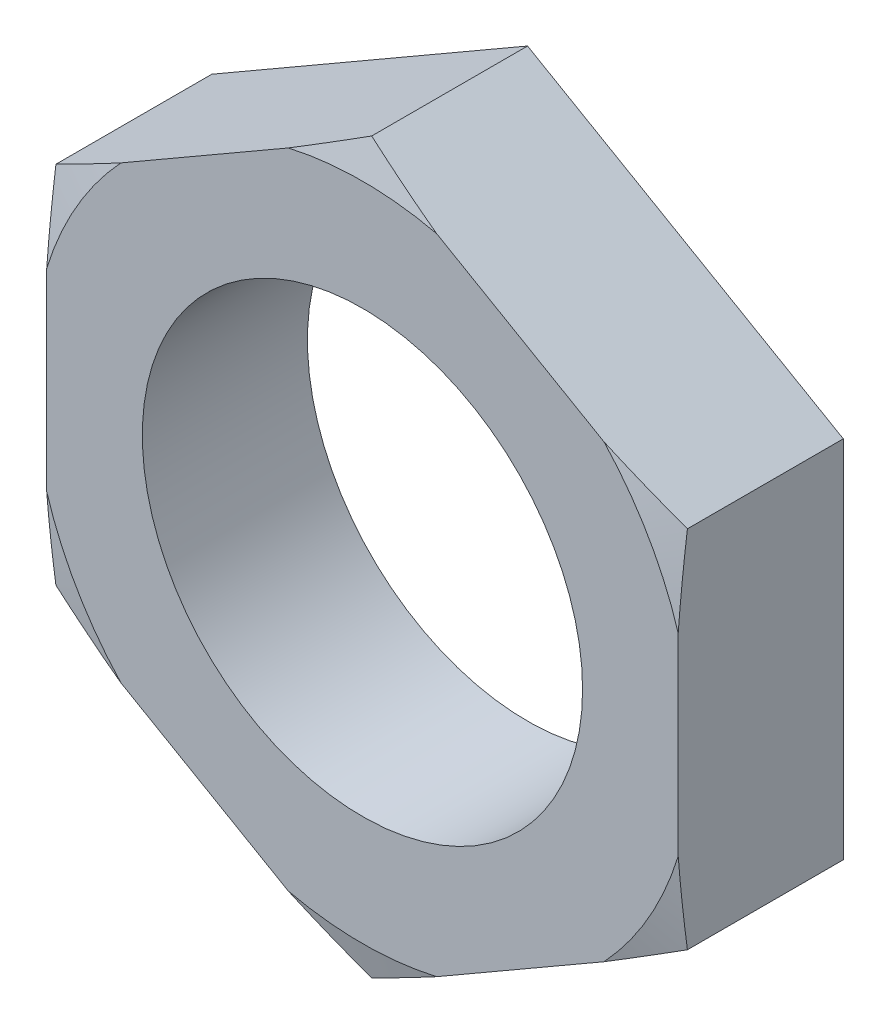
ISO-10303-21;
HEADER;
FILE_DESCRIPTION(('STEP AP214'),'2;1');
FILE_NAME('part.step','',(''),(''),'','','');
FILE_SCHEMA(('AUTOMOTIVE_DESIGN { 1 0 10303 214 1 1 1 1 }'));
ENDSEC;
DATA;
#1=APPLICATION_CONTEXT('core data for automotive mechanical design processes');
#2=APPLICATION_PROTOCOL_DEFINITION('international standard','automotive_design',2000,#1);
#3=PRODUCT_CONTEXT('',#1,'mechanical');
#4=PRODUCT('Part','Part','',(#3));
#5=PRODUCT_RELATED_PRODUCT_CATEGORY('part','',(#4));
#6=PRODUCT_DEFINITION_FORMATION('','',#4);
#7=PRODUCT_DEFINITION_CONTEXT('part definition',#1,'design');
#8=PRODUCT_DEFINITION('design','',#6,#7);
#9=PRODUCT_DEFINITION_SHAPE('','',#8);
#10=(LENGTH_UNIT() NAMED_UNIT(*) SI_UNIT(.MILLI.,.METRE.));
#11=(NAMED_UNIT(*) PLANE_ANGLE_UNIT() SI_UNIT($,.RADIAN.));
#12=(NAMED_UNIT(*) SI_UNIT($,.STERADIAN.) SOLID_ANGLE_UNIT());
#13=UNCERTAINTY_MEASURE_WITH_UNIT(LENGTH_MEASURE(1.E-05),#10,'distance_accuracy_value','');
#14=(GEOMETRIC_REPRESENTATION_CONTEXT(3) GLOBAL_UNCERTAINTY_ASSIGNED_CONTEXT((#13)) GLOBAL_UNIT_ASSIGNED_CONTEXT((#10,
#11,#12)) REPRESENTATION_CONTEXT('',''));
#15=CARTESIAN_POINT('',(0.,0.,0.));
#16=DIRECTION('',(0.,0.,1.));
#17=DIRECTION('',(1.,0.,0.));
#18=AXIS2_PLACEMENT_3D('',#15,#16,#17);
#19=CARTESIAN_POINT('',(5.7374183000719,3.3125,3.));
#20=DIRECTION('',(0.,0.,-1.));
#21=DIRECTION('',(-1.,0.,0.));
#22=AXIS2_PLACEMENT_3D('',#19,#20,#21);
#23=PLANE('',#22);
#24=CARTESIAN_POINT('',(0.,0.,3.));
#25=DIRECTION('',(0.,0.,1.));
#26=DIRECTION('',(1.,0.,0.));
#27=AXIS2_PLACEMENT_3D('',#24,#25,#26);
#28=CIRCLE('',#27,4.);
#29=CARTESIAN_POINT('',(4.,0.,3.));
#30=VERTEX_POINT('',#29);
#31=EDGE_CURVE('E184',#30,#30,#28,.T.);
#32=ORIENTED_EDGE('',*,*,#31,.F.);
#33=EDGE_LOOP('',(#32));
#34=FACE_BOUND('',#33,.T.);
#35=CARTESIAN_POINT('',(0.,0.,3.));
#36=DIRECTION('',(0.,0.,1.));
#37=DIRECTION('',(1.,0.,0.));
#38=AXIS2_PLACEMENT_3D('',#35,#36,#37);
#39=CIRCLE('',#38,6.);
#40=CARTESIAN_POINT('',(-4.38907865693222,4.09096425592575,3.));
#41=VERTEX_POINT('',#40);
#42=CARTESIAN_POINT('',(-5.73741830007191,1.75557148814852,3.));
#43=VERTEX_POINT('',#42);
#44=EDGE_CURVE('E242',#41,#43,#39,.T.);
#45=ORIENTED_EDGE('',*,*,#44,.T.);
#46=DIRECTION('',(0.,-1.,0.));
#47=VECTOR('',#46,1.);
#48=CARTESIAN_POINT('',(-5.73741830007191,3.3125,3.));
#49=LINE('',#48,#47);
#50=CARTESIAN_POINT('',(-5.73741830007191,-1.75557148814853,3.));
#51=VERTEX_POINT('',#50);
#52=EDGE_CURVE('E161',#43,#51,#49,.T.);
#53=ORIENTED_EDGE('',*,*,#52,.T.);
#54=CARTESIAN_POINT('',(-4.38907865693223,-4.09096425592574,3.));
#55=VERTEX_POINT('',#54);
#56=EDGE_CURVE('E243',#51,#55,#39,.T.);
#57=ORIENTED_EDGE('',*,*,#56,.T.);
#58=DIRECTION('',(0.866025403784439,-0.5,0.));
#59=VECTOR('',#58,1.);
#60=CARTESIAN_POINT('',(-5.73741830007191,-3.3125,3.));
#61=LINE('',#60,#59);
#62=CARTESIAN_POINT('',(-1.34833964313968,-5.84653574407426,3.));
#63=VERTEX_POINT('',#62);
#64=EDGE_CURVE('E172',#55,#63,#61,.T.);
#65=ORIENTED_EDGE('',*,*,#64,.T.);
#66=CARTESIAN_POINT('',(1.34833964313968,-5.84653574407426,3.));
#67=VERTEX_POINT('',#66);
#68=EDGE_CURVE('E406',#63,#67,#39,.T.);
#69=ORIENTED_EDGE('',*,*,#68,.T.);
#70=DIRECTION('',(0.866025403784439,0.5,0.));
#71=VECTOR('',#70,1.);
#72=CARTESIAN_POINT('',(0.,-6.625,3.));
#73=LINE('',#72,#71);
#74=CARTESIAN_POINT('',(4.38907865693222,-4.09096425592574,3.));
#75=VERTEX_POINT('',#74);
#76=EDGE_CURVE('E175',#67,#75,#73,.T.);
#77=ORIENTED_EDGE('',*,*,#76,.T.);
#78=CARTESIAN_POINT('',(5.7374183000719,-1.75557148814853,3.));
#79=VERTEX_POINT('',#78);
#80=EDGE_CURVE('E155',#75,#79,#39,.T.);
#81=ORIENTED_EDGE('',*,*,#80,.T.);
#82=DIRECTION('',(0.,1.,0.));
#83=VECTOR('',#82,1.);
#84=CARTESIAN_POINT('',(5.7374183000719,-3.3125,3.));
#85=LINE('',#84,#83);
#86=CARTESIAN_POINT('',(5.7374183000719,1.75557148814853,3.));
#87=VERTEX_POINT('',#86);
#88=EDGE_CURVE('E152',#79,#87,#85,.T.);
#89=ORIENTED_EDGE('',*,*,#88,.T.);
#90=CARTESIAN_POINT('',(4.38907865693222,4.09096425592574,3.));
#91=VERTEX_POINT('',#90);
#92=EDGE_CURVE('E137',#87,#91,#39,.T.);
#93=ORIENTED_EDGE('',*,*,#92,.T.);
#94=DIRECTION('',(-0.866025403784439,0.5,0.));
#95=VECTOR('',#94,1.);
#96=CARTESIAN_POINT('',(5.7374183000719,3.3125,3.));
#97=LINE('',#96,#95);
#98=CARTESIAN_POINT('',(1.34833964313968,5.84653574407426,3.));
#99=VERTEX_POINT('',#98);
#100=EDGE_CURVE('E149',#91,#99,#97,.T.);
#101=ORIENTED_EDGE('',*,*,#100,.T.);
#102=CARTESIAN_POINT('',(-1.34833964313969,5.84653574407426,3.));
#103=VERTEX_POINT('',#102);
#104=EDGE_CURVE('E153',#99,#103,#39,.T.);
#105=ORIENTED_EDGE('',*,*,#104,.T.);
#106=DIRECTION('',(-0.866025403784439,-0.5,0.));
#107=VECTOR('',#106,1.);
#108=CARTESIAN_POINT('',(0.,6.625,3.));
#109=LINE('',#108,#107);
#110=EDGE_CURVE('E157',#103,#41,#109,.T.);
#111=ORIENTED_EDGE('',*,*,#110,.T.);
#112=EDGE_LOOP('',(#45,#53,#57,#65,#69,#77,#81,#89,#93,#101,#105,#111));
#113=FACE_BOUND('',#112,.T.);
#114=ADVANCED_FACE('F40',(#34,#113),#23,.F.);
#115=CARTESIAN_POINT('',(5.7374183000719,3.3125,3.));
#116=DIRECTION('',(-0.5,-0.866025403784439,0.));
#117=DIRECTION('',(0.866025403784439,-0.5,0.));
#118=AXIS2_PLACEMENT_3D('',#115,#116,#117);
#119=PLANE('',#118);
#120=CARTESIAN_POINT('',(10.1011747624086,0.793084031791966,1.89276399036621));
#121=CARTESIAN_POINT('',(9.91630137989778,0.89982072895056,1.93990265340107));
#122=CARTESIAN_POINT('',(9.73132388828718,1.00661753352596,1.98650269504357));
#123=CARTESIAN_POINT('',(9.36112150084861,1.22035398156826,2.07839898094154));
#124=CARTESIAN_POINT('',(9.17589659890519,1.32729362856592,2.12369519232088));
#125=CARTESIAN_POINT('',(8.80509314551345,1.54137710219808,2.21277321155626));
#126=CARTESIAN_POINT('',(8.61951447980122,1.64852099480289,2.25655438778063));
#127=CARTESIAN_POINT('',(8.24804229100851,1.86299056299882,2.34228684448169));
#128=CARTESIAN_POINT('',(8.06214876961613,1.97031623761532,2.38423813473722));
#129=CARTESIAN_POINT('',(7.50169668318572,2.2938934005838,2.50733822853523));
#130=CARTESIAN_POINT('',(7.12658453565356,2.5104644999378,2.58519228682617));
#131=CARTESIAN_POINT('',(6.37456342886461,2.94464408837867,2.7284381568613));
#132=CARTESIAN_POINT('',(5.99765452851615,3.16225254345482,2.79383037433783));
#133=CARTESIAN_POINT('',(5.25032522592084,3.59372331748152,2.90580355199954));
#134=CARTESIAN_POINT('',(4.87995077467182,3.8075591066111,2.95277636869086));
#135=CARTESIAN_POINT('',(4.32322600104312,4.12898430453016,3.00677294331534));
#136=CARTESIAN_POINT('',(4.13746853988225,4.23623142473537,3.02202759993912));
#137=CARTESIAN_POINT('',(3.76565215646236,4.45089971379196,3.04652144075893));
#138=CARTESIAN_POINT('',(3.57959323686916,4.55832088110423,3.05576067786189));
#139=CARTESIAN_POINT('',(3.20786330120623,4.77293925952506,3.0678398264683));
#140=CARTESIAN_POINT('',(3.02219274405471,4.88013620567708,3.07069839221015));
#141=CARTESIAN_POINT('',(2.6508605106961,5.09452497056546,3.06995422401594));
#142=CARTESIAN_POINT('',(2.46519883453383,5.20171678927594,3.06635146033778));
#143=CARTESIAN_POINT('',(2.09403155902872,5.41601031570319,3.0528316029166));
#144=CARTESIAN_POINT('',(1.90852597713522,5.52311201334559,3.0429138782657));
#145=CARTESIAN_POINT('',(1.53783017434664,5.73713333487304,3.01714860788911));
#146=CARTESIAN_POINT('',(1.35263995056587,5.84405296042415,3.00130111671989));
#147=CARTESIAN_POINT('',(0.936418127825364,6.08435874182598,2.95959019235434));
#148=CARTESIAN_POINT('',(0.705500706415405,6.21767897723759,2.93221323592658));
#149=CARTESIAN_POINT('',(0.244423508773176,6.48388202141353,2.87029938601113));
#150=CARTESIAN_POINT('',(0.0142636556750895,6.61676487455636,2.83576324319338));
#151=CARTESIAN_POINT('',(-0.445713087020306,6.88233257077251,2.76070781002039));
#152=CARTESIAN_POINT('',(-0.675528738668795,7.01501669911576,2.7201785016515));
#153=CARTESIAN_POINT('',(-1.13448204948656,7.27999351666187,2.6342930737739));
#154=CARTESIAN_POINT('',(-1.36361969389925,7.41228619734501,2.5889368499918));
#155=CARTESIAN_POINT('',(-1.82477806672706,7.6785361080362,2.4936136881588));
#156=CARTESIAN_POINT('',(-2.05678947543624,7.8124879573095,2.44358698651228));
#157=CARTESIAN_POINT('',(-2.52027302680186,8.0800803104554,2.34031551782839));
#158=CARTESIAN_POINT('',(-2.75174516725316,8.21372081305486,2.28707073765571));
#159=CARTESIAN_POINT('',(-3.21353256508596,8.48033389150201,2.17816150233583));
#160=CARTESIAN_POINT('',(-3.44384920570795,8.61330726596396,2.1225048337041));
#161=CARTESIAN_POINT('',(-3.90408262017941,8.87902315169912,2.0090925334001));
#162=CARTESIAN_POINT('',(-4.13399941417125,9.01176567460153,1.95133701086811));
#163=CARTESIAN_POINT('',(-4.36375646233666,9.14441596820804,1.89276399036621));
#164=B_SPLINE_CURVE_WITH_KNOTS('',3,(#120,#121,#122,#123,#124,#125,#126,#127,#128,#129,#130,
#131,#132,#133,#134,#135,#136,#137,#138,#139,#140,#141,#142,#143,#144,#145,#146,#147,#148,#149,
#150,#151,#152,#153,#154,#155,#156,#157,#158,#159,#160,#161,#162,#163),.UNSPECIFIED.,.F.,.F.,(4,
2,2,2,2,2,2,2,2,2,2,2,2,2,2,2,2,2,2,2,2,4),(0.,0.655848966390485,1.31171445557107,
1.96785016499409,2.62398236762356,3.94409834718996,5.26417133910368,6.55440053876464,
7.19943682159954,7.84446743112305,8.48760977500598,9.13075507934034,9.77396464838363,
10.4171682997622,11.2211746848525,12.0250968091931,12.8303782653415,13.6356771211074,
14.4532563751666,15.270838966584,16.085954402245,16.9010275124287),.UNSPECIFIED.);
#165=CARTESIAN_POINT('',(5.7374183000719,3.31250000000003,2.8325317547306));
#166=VERTEX_POINT('',#165);
#167=EDGE_CURVE('E134',#166,#91,#164,.T.);
#168=ORIENTED_EDGE('',*,*,#167,.F.);
#169=DIRECTION('',(0.,0.,-1.));
#170=VECTOR('',#169,1.);
#171=CARTESIAN_POINT('',(5.7374183000719,3.3125,3.));
#172=LINE('',#171,#170);
#173=CARTESIAN_POINT('',(5.7374183000719,3.3125,0.));
#174=VERTEX_POINT('',#173);
#175=EDGE_CURVE('E179',#166,#174,#172,.T.);
#176=ORIENTED_EDGE('',*,*,#175,.T.);
#177=DIRECTION('',(-0.866025403784439,0.5,0.));
#178=VECTOR('',#177,1.);
#179=CARTESIAN_POINT('',(5.7374183000719,3.3125,0.));
#180=LINE('',#179,#178);
#181=CARTESIAN_POINT('',(0.,6.625,0.));
#182=VERTEX_POINT('',#181);
#183=EDGE_CURVE('E180',#174,#182,#180,.T.);
#184=ORIENTED_EDGE('',*,*,#183,.T.);
#185=DIRECTION('',(0.,0.,-1.));
#186=VECTOR('',#185,1.);
#187=CARTESIAN_POINT('',(0.,6.625,3.));
#188=LINE('',#187,#186);
#189=CARTESIAN_POINT('',(0.,6.625,2.83253175473055));
#190=VERTEX_POINT('',#189);
#191=EDGE_CURVE('E203',#190,#182,#188,.T.);
#192=ORIENTED_EDGE('',*,*,#191,.F.);
#193=EDGE_CURVE('E62',#99,#190,#164,.T.);
#194=ORIENTED_EDGE('',*,*,#193,.F.);
#195=ORIENTED_EDGE('',*,*,#100,.F.);
#196=EDGE_LOOP('',(#168,#176,#184,#192,#194,#195));
#197=FACE_BOUND('',#196,.T.);
#198=ADVANCED_FACE('F42',(#197),#119,.F.);
#199=CARTESIAN_POINT('',(0.,6.625,3.));
#200=DIRECTION('',(0.5,-0.866025403784439,0.));
#201=DIRECTION('',(0.866025403784439,0.5,0.));
#202=AXIS2_PLACEMENT_3D('',#199,#200,#201);
#203=PLANE('',#202);
#204=CARTESIAN_POINT('',(4.36375646233665,9.14441596820804,1.89276399036621));
#205=CARTESIAN_POINT('',(4.17888307982588,9.03767927104944,1.93990265340107));
#206=CARTESIAN_POINT('',(3.99390558821527,8.93088246647404,1.98650269504357));
#207=CARTESIAN_POINT('',(3.6237032007767,8.71714601843174,2.07839898094154));
#208=CARTESIAN_POINT('',(3.43847829883329,8.61020637143409,2.12369519232088));
#209=CARTESIAN_POINT('',(3.06767484544154,8.39612289780192,2.21277321155626));
#210=CARTESIAN_POINT('',(2.88209617972931,8.28897900519711,2.25655438778063));
#211=CARTESIAN_POINT('',(2.5106239909366,8.07450943700118,2.34228684448169));
#212=CARTESIAN_POINT('',(2.32473046954423,7.96718376238469,2.38423813473722));
#213=CARTESIAN_POINT('',(1.76427838311381,7.6436065994162,2.50733822853523));
#214=CARTESIAN_POINT('',(1.38916623558165,7.4270355000622,2.58519228682617));
#215=CARTESIAN_POINT('',(0.637145128792704,6.99285591162133,2.7284381568613));
#216=CARTESIAN_POINT('',(0.260236228444246,6.77524745654518,2.79383037433783));
#217=CARTESIAN_POINT('',(-0.48709307415107,6.34377668251848,2.90580355199954));
#218=CARTESIAN_POINT('',(-0.857467525400092,6.1299408933889,2.95277636869086));
#219=CARTESIAN_POINT('',(-1.41419229902879,5.80851569546984,3.00677294331534));
#220=CARTESIAN_POINT('',(-1.59994976018965,5.70126857526463,3.02202759993912));
#221=CARTESIAN_POINT('',(-1.97176614360954,5.48660028620804,3.04652144075893));
#222=CARTESIAN_POINT('',(-2.15782506320275,5.37917911889577,3.05576067786189));
#223=CARTESIAN_POINT('',(-2.52955499886568,5.16456074047494,3.0678398264683));
#224=CARTESIAN_POINT('',(-2.7152255560172,5.05736379432292,3.07069839221015));
#225=CARTESIAN_POINT('',(-3.0865577893758,4.84297502943454,3.06995422401594));
#226=CARTESIAN_POINT('',(-3.27221946553808,4.73578321072406,3.06635146033778));
#227=CARTESIAN_POINT('',(-3.64338674104319,4.52148968429681,3.0528316029166));
#228=CARTESIAN_POINT('',(-3.82889232293669,4.41438798665441,3.04291387826569));
#229=CARTESIAN_POINT('',(-4.19958812572527,4.20036666512696,3.01714860788911));
#230=CARTESIAN_POINT('',(-4.38477834950604,4.09344703957585,3.00130111671989));
#231=CARTESIAN_POINT('',(-4.80100017224654,3.85314125817402,2.95959019235434));
#232=CARTESIAN_POINT('',(-5.0319175936565,3.71982102276241,2.93221323592658));
#233=CARTESIAN_POINT('',(-5.49299479129873,3.45361797858647,2.87029938601113));
#234=CARTESIAN_POINT('',(-5.72315464439682,3.32073512544364,2.83576324319338));
#235=CARTESIAN_POINT('',(-6.18313138709221,3.05516742922749,2.76070781002039));
#236=CARTESIAN_POINT('',(-6.4129470387407,2.92248330088424,2.7201785016515));
#237=CARTESIAN_POINT('',(-6.87190034955847,2.65750648333814,2.6342930737739));
#238=CARTESIAN_POINT('',(-7.10103799397116,2.52521380265499,2.5889368499918));
#239=CARTESIAN_POINT('',(-7.56219636679897,2.2589638919638,2.4936136881588));
#240=CARTESIAN_POINT('',(-7.79420777550814,2.1250120426905,2.44358698651228));
#241=CARTESIAN_POINT('',(-8.25769132687376,1.8574196895446,2.34031551782839));
#242=CARTESIAN_POINT('',(-8.48916346732507,1.72377918694514,2.28707073765571));
#243=CARTESIAN_POINT('',(-8.95095086515787,1.45716610849799,2.17816150233583));
#244=CARTESIAN_POINT('',(-9.18126750577986,1.32419273403604,2.1225048337041));
#245=CARTESIAN_POINT('',(-9.64150092025131,1.05847684830088,2.0090925334001));
#246=CARTESIAN_POINT('',(-9.87141771424315,0.925734325398474,1.95133701086811));
#247=CARTESIAN_POINT('',(-10.1011747624086,0.793084031791963,1.89276399036621));
#248=B_SPLINE_CURVE_WITH_KNOTS('',3,(#204,#205,#206,#207,#208,#209,#210,#211,#212,#213,#214,
#215,#216,#217,#218,#219,#220,#221,#222,#223,#224,#225,#226,#227,#228,#229,#230,#231,#232,#233,
#234,#235,#236,#237,#238,#239,#240,#241,#242,#243,#244,#245,#246,#247),.UNSPECIFIED.,.F.,.F.,(4,
2,2,2,2,2,2,2,2,2,2,2,2,2,2,2,2,2,2,2,2,4),(0.,0.655848966390486,1.31171445557107,
1.96785016499409,2.62398236762357,3.94409834718996,5.26417133910369,6.55440053876464,
7.19943682159954,7.84446743112305,8.48760977500598,9.13075507934034,9.77396464838363,
10.4171682997622,11.2211746848525,12.0250968091931,12.8303782653415,13.6356771211074,
14.4532563751666,15.270838966584,16.085954402245,16.9010275124287),.UNSPECIFIED.);
#249=EDGE_CURVE('E210',#190,#103,#248,.T.);
#250=ORIENTED_EDGE('',*,*,#249,.F.);
#251=ORIENTED_EDGE('',*,*,#191,.T.);
#252=DIRECTION('',(-0.866025403784439,-0.5,0.));
#253=VECTOR('',#252,1.);
#254=CARTESIAN_POINT('',(0.,6.625,0.));
#255=LINE('',#254,#253);
#256=CARTESIAN_POINT('',(-5.73741830007191,3.3125,0.));
#257=VERTEX_POINT('',#256);
#258=EDGE_CURVE('E183',#182,#257,#255,.T.);
#259=ORIENTED_EDGE('',*,*,#258,.T.);
#260=DIRECTION('',(0.,0.,-1.));
#261=VECTOR('',#260,1.);
#262=CARTESIAN_POINT('',(-5.73741830007191,3.3125,3.));
#263=LINE('',#262,#261);
#264=CARTESIAN_POINT('',(-5.73741830007191,3.3125,2.83253175473055));
#265=VERTEX_POINT('',#264);
#266=EDGE_CURVE('E202',#265,#257,#263,.T.);
#267=ORIENTED_EDGE('',*,*,#266,.F.);
#268=EDGE_CURVE('E70',#41,#265,#248,.T.);
#269=ORIENTED_EDGE('',*,*,#268,.F.);
#270=ORIENTED_EDGE('',*,*,#110,.F.);
#271=EDGE_LOOP('',(#250,#251,#259,#267,#269,#270));
#272=FACE_BOUND('',#271,.T.);
#273=ADVANCED_FACE('F206',(#272),#203,.F.);
#274=CARTESIAN_POINT('',(-5.73741830007191,3.3125,3.));
#275=DIRECTION('',(1.,0.,0.));
#276=DIRECTION('',(0.,1.,0.));
#277=AXIS2_PLACEMENT_3D('',#274,#275,#276);
#278=PLANE('',#277);
#279=CARTESIAN_POINT('',(-5.73741830007191,7.67625646233666,2.03981232010557));
#280=CARTESIAN_POINT('',(-5.73741830007191,7.47400765733464,2.08321264057062));
#281=CARTESIAN_POINT('',(-5.73741830007191,7.2716341906839,2.12603892045379));
#282=CARTESIAN_POINT('',(-5.73741830007191,6.86659397614361,2.21031097272531));
#283=CARTESIAN_POINT('',(-5.73741830007191,6.66392721964959,2.2517567037181));
#284=CARTESIAN_POINT('',(-5.73741830007191,6.25816704818478,2.33305294612345));
#285=CARTESIAN_POINT('',(-5.73741830007191,6.05507347042119,2.37290264861262));
#286=CARTESIAN_POINT('',(-5.73741830007191,5.64852225392863,2.45068654928662));
#287=CARTESIAN_POINT('',(-5.73741830007191,5.44506461758693,2.48862075998485));
#288=CARTESIAN_POINT('',(-5.73741830007191,4.83218984864846,2.59939119017767));
#289=CARTESIAN_POINT('',(-5.73741830007191,4.42214228243033,2.66881400436914));
#290=CARTESIAN_POINT('',(-5.73741830007191,3.60010912972811,2.7950159136556));
#291=CARTESIAN_POINT('',(-5.73741830007191,3.18812371722492,2.85179612249215));
#292=CARTESIAN_POINT('',(-5.73741830007191,2.3706113396577,2.94714926288916));
#293=CARTESIAN_POINT('',(-5.73741830007191,1.96512732691746,2.98607492068115));
#294=CARTESIAN_POINT('',(-5.73741830007191,1.35584118019114,3.02889166489745));
#295=CARTESIAN_POINT('',(-5.73741830007191,1.15257626023055,3.04056848600391));
#296=CARTESIAN_POINT('',(-5.73741830007191,0.745798770356058,3.05835611982971));
#297=CARTESIAN_POINT('',(-5.73741830007191,0.542286202031906,3.06446696809228));
#298=CARTESIAN_POINT('',(-5.73741830007191,0.135651735095675,3.07088875386009));
#299=CARTESIAN_POINT('',(-5.73741830007191,-0.0674699460576156,3.07121340520488));
#300=CARTESIAN_POINT('',(-5.73741830007191,-0.473640915158216,3.06608700080427));
#301=CARTESIAN_POINT('',(-5.73741830007191,-0.676690202657653,3.06063590992618));
#302=CARTESIAN_POINT('',(-5.73741830007191,-1.08257305594772,3.04415529160098));
#303=CARTESIAN_POINT('',(-5.73741830007191,-1.28540660668071,3.03312539748389));
#304=CARTESIAN_POINT('',(-5.73741830007191,-1.69072506664752,3.00586048122157));
#305=CARTESIAN_POINT('',(-5.73741830007191,-1.89320996600275,2.98962531395406));
#306=CARTESIAN_POINT('',(-5.73741830007191,-2.3288043925336,2.94958421924793));
#307=CARTESIAN_POINT('',(-5.73741830007191,-2.56184185908063,2.92499855811425));
#308=CARTESIAN_POINT('',(-5.73741830007191,-3.02724564467859,2.87039240323882));
#309=CARTESIAN_POINT('',(-5.73741830007191,-3.25961203433255,2.84037250408616));
#310=CARTESIAN_POINT('',(-5.73741830007191,-3.72397016192857,2.77568815668753));
#311=CARTESIAN_POINT('',(-5.73741830007191,-3.95596114121209,2.74101830431465));
#312=CARTESIAN_POINT('',(-5.73741830007191,-4.41933389409557,2.66781970592608));
#313=CARTESIAN_POINT('',(-5.73741830007191,-4.65071565618269,2.62929088751414));
#314=CARTESIAN_POINT('',(-5.73741830007191,-5.11591637074182,2.54851342970787));
#315=CARTESIAN_POINT('',(-5.73741830007191,-5.34972803871433,2.50622304726593));
#316=CARTESIAN_POINT('',(-5.73741830007191,-5.8168433735132,2.41893173619159));
#317=CARTESIAN_POINT('',(-5.73741830007191,-6.05014703921711,2.3739308015765));
#318=CARTESIAN_POINT('',(-5.73741830007191,-6.5158086413751,2.28179307090022));
#319=CARTESIAN_POINT('',(-5.7374183000719,-6.7481675325504,2.23466108099269));
#320=CARTESIAN_POINT('',(-5.7374183000719,-7.21249091935398,2.13853916715966));
#321=CARTESIAN_POINT('',(-5.7374183000719,-7.44445543130772,2.0895493221987));
#322=CARTESIAN_POINT('',(-5.7374183000719,-7.67625646233666,2.03981232010557));
#323=B_SPLINE_CURVE_WITH_KNOTS('',3,(#279,#280,#281,#282,#283,#284,#285,#286,#287,#288,#289,
#290,#291,#292,#293,#294,#295,#296,#297,#298,#299,#300,#301,#302,#303,#304,#305,#306,#307,#308,
#309,#310,#311,#312,#313,#314,#315,#316,#317,#318,#319,#320,#321,#322),.UNSPECIFIED.,.F.,.F.,(4,
2,2,2,2,2,2,2,2,2,2,2,2,2,2,2,2,2,2,2,2,4),(0.,0.62056021997476,1.24113903063756,
1.86202849173837,2.48291389620852,3.7304132673842,4.97780269744816,6.19935815873779,
6.81009303518145,7.42082401156463,8.03010730418355,8.63939430297198,9.24872135269565,
9.8580653918484,10.5609812313423,11.2638202074835,11.967483210566,12.6711594172131,
13.3839566974811,14.0967555510806,14.8080200405742,15.5192543329524),.UNSPECIFIED.);
#324=EDGE_CURVE('E240',#265,#43,#323,.T.);
#325=ORIENTED_EDGE('',*,*,#324,.F.);
#326=ORIENTED_EDGE('',*,*,#266,.T.);
#327=DIRECTION('',(0.,-1.,0.));
#328=VECTOR('',#327,1.);
#329=CARTESIAN_POINT('',(-5.73741830007191,3.3125,0.));
#330=LINE('',#329,#328);
#331=CARTESIAN_POINT('',(-5.73741830007191,-3.3125,0.));
#332=VERTEX_POINT('',#331);
#333=EDGE_CURVE('E187',#257,#332,#330,.T.);
#334=ORIENTED_EDGE('',*,*,#333,.T.);
#335=DIRECTION('',(0.,0.,-1.));
#336=VECTOR('',#335,1.);
#337=CARTESIAN_POINT('',(-5.73741830007191,-3.3125,3.));
#338=LINE('',#337,#336);
#339=CARTESIAN_POINT('',(-5.73741830007191,-3.3125,2.83253175473055));
#340=VERTEX_POINT('',#339);
#341=EDGE_CURVE('E200',#340,#332,#338,.T.);
#342=ORIENTED_EDGE('',*,*,#341,.F.);
#343=EDGE_CURVE('E278',#51,#340,#323,.T.);
#344=ORIENTED_EDGE('',*,*,#343,.F.);
#345=ORIENTED_EDGE('',*,*,#52,.F.);
#346=EDGE_LOOP('',(#325,#326,#334,#342,#344,#345));
#347=FACE_BOUND('',#346,.T.);
#348=ADVANCED_FACE('F238',(#347),#278,.F.);
#349=CARTESIAN_POINT('',(-5.73741830007191,-3.3125,3.));
#350=DIRECTION('',(0.5,0.866025403784439,0.));
#351=DIRECTION('',(-0.866025403784439,0.5,0.));
#352=AXIS2_PLACEMENT_3D('',#349,#350,#351);
#353=PLANE('',#352);
#354=CARTESIAN_POINT('',(-10.1011747624086,-0.793084031791962,1.89276399036621));
#355=CARTESIAN_POINT('',(-9.91630137989778,-0.899820728950556,1.93990265340107));
#356=CARTESIAN_POINT('',(-9.73132388828718,-1.00661753352596,1.98650269504357));
#357=CARTESIAN_POINT('',(-9.36112150084861,-1.22035398156826,2.07839898094154));
#358=CARTESIAN_POINT('',(-9.1758965989052,-1.32729362856591,2.12369519232088));
#359=CARTESIAN_POINT('',(-8.80509314551345,-1.54137710219808,2.21277321155626));
#360=CARTESIAN_POINT('',(-8.61951447980122,-1.64852099480289,2.25655438778063));
#361=CARTESIAN_POINT('',(-8.24804229100851,-1.86299056299882,2.34228684448169));
#362=CARTESIAN_POINT('',(-8.06214876961614,-1.97031623761531,2.38423813473722));
#363=CARTESIAN_POINT('',(-7.50169668318572,-2.2938934005838,2.50733822853523));
#364=CARTESIAN_POINT('',(-7.12658453565356,-2.51046449993779,2.58519228682617));
#365=CARTESIAN_POINT('',(-6.37456342886461,-2.94464408837867,2.7284381568613));
#366=CARTESIAN_POINT('',(-5.99765452851616,-3.16225254345482,2.79383037433783));
#367=CARTESIAN_POINT('',(-5.25032522592084,-3.59372331748152,2.90580355199954));
#368=CARTESIAN_POINT('',(-4.87995077467182,-3.8075591066111,2.95277636869086));
#369=CARTESIAN_POINT('',(-4.32322600104312,-4.12898430453016,3.00677294331534));
#370=CARTESIAN_POINT('',(-4.13746853988226,-4.23623142473537,3.02202759993912));
#371=CARTESIAN_POINT('',(-3.76565215646236,-4.45089971379196,3.04652144075893));
#372=CARTESIAN_POINT('',(-3.57959323686916,-4.55832088110422,3.05576067786189));
#373=CARTESIAN_POINT('',(-3.20786330120623,-4.77293925952506,3.0678398264683));
#374=CARTESIAN_POINT('',(-3.02219274405471,-4.88013620567708,3.07069839221015));
#375=CARTESIAN_POINT('',(-2.6508605106961,-5.09452497056545,3.06995422401594));
#376=CARTESIAN_POINT('',(-2.46519883453383,-5.20171678927594,3.06635146033778));
#377=CARTESIAN_POINT('',(-2.09403155902872,-5.41601031570319,3.0528316029166));
#378=CARTESIAN_POINT('',(-1.90852597713522,-5.52311201334559,3.0429138782657));
#379=CARTESIAN_POINT('',(-1.53783017434664,-5.73713333487304,3.01714860788911));
#380=CARTESIAN_POINT('',(-1.35263995056587,-5.84405296042415,3.00130111671989));
#381=CARTESIAN_POINT('',(-0.936418127825365,-6.08435874182598,2.95959019235434));
#382=CARTESIAN_POINT('',(-0.705500706415406,-6.21767897723759,2.93221323592658));
#383=CARTESIAN_POINT('',(-0.244423508773177,-6.48388202141353,2.87029938601113));
#384=CARTESIAN_POINT('',(-0.0142636556750907,-6.61676487455636,2.83576324319338));
#385=CARTESIAN_POINT('',(0.445713087020305,-6.88233257077251,2.76070781002039));
#386=CARTESIAN_POINT('',(0.675528738668794,-7.01501669911575,2.7201785016515));
#387=CARTESIAN_POINT('',(1.13448204948656,-7.27999351666186,2.6342930737739));
#388=CARTESIAN_POINT('',(1.36361969389925,-7.41228619734501,2.5889368499918));
#389=CARTESIAN_POINT('',(1.82477806672706,-7.67853610803619,2.4936136881588));
#390=CARTESIAN_POINT('',(2.05678947543623,-7.8124879573095,2.44358698651228));
#391=CARTESIAN_POINT('',(2.52027302680185,-8.0800803104554,2.34031551782839));
#392=CARTESIAN_POINT('',(2.75174516725316,-8.21372081305486,2.28707073765571));
#393=CARTESIAN_POINT('',(3.21353256508596,-8.48033389150201,2.17816150233583));
#394=CARTESIAN_POINT('',(3.44384920570795,-8.61330726596396,2.1225048337041));
#395=CARTESIAN_POINT('',(3.9040826201794,-8.87902315169912,2.0090925334001));
#396=CARTESIAN_POINT('',(4.13399941417125,-9.01176567460152,1.95133701086811));
#397=CARTESIAN_POINT('',(4.36375646233666,-9.14441596820804,1.89276399036621));
#398=B_SPLINE_CURVE_WITH_KNOTS('',3,(#354,#355,#356,#357,#358,#359,#360,#361,#362,#363,#364,
#365,#366,#367,#368,#369,#370,#371,#372,#373,#374,#375,#376,#377,#378,#379,#380,#381,#382,#383,
#384,#385,#386,#387,#388,#389,#390,#391,#392,#393,#394,#395,#396,#397),.UNSPECIFIED.,.F.,.F.,(4,
2,2,2,2,2,2,2,2,2,2,2,2,2,2,2,2,2,2,2,2,4),(0.,0.655848966390489,1.31171445557107,
1.96785016499409,2.62398236762357,3.94409834718996,5.26417133910368,6.55440053876464,
7.19943682159954,7.84446743112306,8.48760977500598,9.13075507934034,9.77396464838363,
10.4171682997622,11.2211746848525,12.0250968091931,12.8303782653415,13.6356771211074,
14.4532563751666,15.270838966584,16.085954402245,16.9010275124287),.UNSPECIFIED.);
#399=EDGE_CURVE('E235',#340,#55,#398,.T.);
#400=ORIENTED_EDGE('',*,*,#399,.F.);
#401=ORIENTED_EDGE('',*,*,#341,.T.);
#402=DIRECTION('',(0.866025403784439,-0.5,0.));
#403=VECTOR('',#402,1.);
#404=CARTESIAN_POINT('',(-5.73741830007191,-3.3125,0.));
#405=LINE('',#404,#403);
#406=CARTESIAN_POINT('',(0.,-6.625,0.));
#407=VERTEX_POINT('',#406);
#408=EDGE_CURVE('E190',#332,#407,#405,.T.);
#409=ORIENTED_EDGE('',*,*,#408,.T.);
#410=DIRECTION('',(0.,0.,-1.));
#411=VECTOR('',#410,1.);
#412=CARTESIAN_POINT('',(0.,-6.625,3.));
#413=LINE('',#412,#411);
#414=CARTESIAN_POINT('',(0.,-6.625,2.83253175473055));
#415=VERTEX_POINT('',#414);
#416=EDGE_CURVE('E198',#415,#407,#413,.T.);
#417=ORIENTED_EDGE('',*,*,#416,.F.);
#418=EDGE_CURVE('E272',#63,#415,#398,.T.);
#419=ORIENTED_EDGE('',*,*,#418,.F.);
#420=ORIENTED_EDGE('',*,*,#64,.F.);
#421=EDGE_LOOP('',(#400,#401,#409,#417,#419,#420));
#422=FACE_BOUND('',#421,.T.);
#423=ADVANCED_FACE('F232',(#422),#353,.F.);
#424=CARTESIAN_POINT('',(0.,-6.625,3.));
#425=DIRECTION('',(-0.5,0.866025403784439,0.));
#426=DIRECTION('',(-0.866025403784439,-0.5,0.));
#427=AXIS2_PLACEMENT_3D('',#424,#425,#426);
#428=PLANE('',#427);
#429=CARTESIAN_POINT('',(-4.36375646233665,-9.14441596820803,1.89276399036621));
#430=CARTESIAN_POINT('',(-4.17888307982588,-9.03767927104944,1.93990265340107));
#431=CARTESIAN_POINT('',(-3.99390558821527,-8.93088246647404,1.98650269504357));
#432=CARTESIAN_POINT('',(-3.6237032007767,-8.71714601843174,2.07839898094154));
#433=CARTESIAN_POINT('',(-3.43847829883329,-8.61020637143408,2.12369519232088));
#434=CARTESIAN_POINT('',(-3.06767484544154,-8.39612289780192,2.21277321155626));
#435=CARTESIAN_POINT('',(-2.88209617972931,-8.28897900519711,2.25655438778063));
#436=CARTESIAN_POINT('',(-2.51062399093661,-8.07450943700118,2.34228684448169));
#437=CARTESIAN_POINT('',(-2.32473046954423,-7.96718376238468,2.38423813473722));
#438=CARTESIAN_POINT('',(-1.76427838311382,-7.6436065994162,2.50733822853523));
#439=CARTESIAN_POINT('',(-1.38916623558165,-7.4270355000622,2.58519228682617));
#440=CARTESIAN_POINT('',(-0.637145128792707,-6.99285591162133,2.7284381568613));
#441=CARTESIAN_POINT('',(-0.260236228444248,-6.77524745654518,2.79383037433783));
#442=CARTESIAN_POINT('',(0.487093074151067,-6.34377668251848,2.90580355199954));
#443=CARTESIAN_POINT('',(0.857467525400089,-6.1299408933889,2.95277636869086));
#444=CARTESIAN_POINT('',(1.41419229902878,-5.80851569546984,3.00677294331534));
#445=CARTESIAN_POINT('',(1.59994976018965,-5.70126857526463,3.02202759993912));
#446=CARTESIAN_POINT('',(1.97176614360954,-5.48660028620804,3.04652144075893));
#447=CARTESIAN_POINT('',(2.15782506320274,-5.37917911889577,3.05576067786189));
#448=CARTESIAN_POINT('',(2.52955499886567,-5.16456074047494,3.0678398264683));
#449=CARTESIAN_POINT('',(2.71522555601719,-5.05736379432292,3.07069839221015));
#450=CARTESIAN_POINT('',(3.0865577893758,-4.84297502943455,3.06995422401594));
#451=CARTESIAN_POINT('',(3.27221946553807,-4.73578321072406,3.06635146033778));
#452=CARTESIAN_POINT('',(3.64338674104318,-4.52148968429681,3.0528316029166));
#453=CARTESIAN_POINT('',(3.82889232293669,-4.41438798665441,3.0429138782657));
#454=CARTESIAN_POINT('',(4.19958812572527,-4.20036666512696,3.01714860788911));
#455=CARTESIAN_POINT('',(4.38477834950603,-4.09344703957585,3.00130111671989));
#456=CARTESIAN_POINT('',(4.80100017224654,-3.85314125817402,2.95959019235434));
#457=CARTESIAN_POINT('',(5.0319175936565,-3.71982102276241,2.93221323592658));
#458=CARTESIAN_POINT('',(5.49299479129873,-3.45361797858647,2.87029938601113));
#459=CARTESIAN_POINT('',(5.72315464439681,-3.32073512544364,2.83576324319338));
#460=CARTESIAN_POINT('',(6.18313138709221,-3.05516742922749,2.76070781002039));
#461=CARTESIAN_POINT('',(6.4129470387407,-2.92248330088425,2.7201785016515));
#462=CARTESIAN_POINT('',(6.87190034955847,-2.65750648333814,2.6342930737739));
#463=CARTESIAN_POINT('',(7.10103799397115,-2.52521380265499,2.5889368499918));
#464=CARTESIAN_POINT('',(7.56219636679897,-2.25896389196381,2.4936136881588));
#465=CARTESIAN_POINT('',(7.79420777550814,-2.1250120426905,2.44358698651228));
#466=CARTESIAN_POINT('',(8.25769132687376,-1.8574196895446,2.34031551782839));
#467=CARTESIAN_POINT('',(8.48916346732506,-1.72377918694514,2.28707073765571));
#468=CARTESIAN_POINT('',(8.95095086515787,-1.45716610849799,2.17816150233583));
#469=CARTESIAN_POINT('',(9.18126750577986,-1.32419273403604,2.1225048337041));
#470=CARTESIAN_POINT('',(9.64150092025131,-1.05847684830088,2.0090925334001));
#471=CARTESIAN_POINT('',(9.87141771424315,-0.925734325398477,1.95133701086811));
#472=CARTESIAN_POINT('',(10.1011747624086,-0.793084031791966,1.89276399036621));
#473=B_SPLINE_CURVE_WITH_KNOTS('',3,(#429,#430,#431,#432,#433,#434,#435,#436,#437,#438,#439,
#440,#441,#442,#443,#444,#445,#446,#447,#448,#449,#450,#451,#452,#453,#454,#455,#456,#457,#458,
#459,#460,#461,#462,#463,#464,#465,#466,#467,#468,#469,#470,#471,#472),.UNSPECIFIED.,.F.,.F.,(4,
2,2,2,2,2,2,2,2,2,2,2,2,2,2,2,2,2,2,2,2,4),(0.,0.655848966390486,1.31171445557107,
1.96785016499409,2.62398236762357,3.94409834718996,5.26417133910368,6.55440053876464,
7.19943682159954,7.84446743112305,8.48760977500597,9.13075507934033,9.77396464838363,
10.4171682997622,11.2211746848525,12.0250968091931,12.8303782653415,13.6356771211074,
14.4532563751666,15.270838966584,16.085954402245,16.9010275124286),.UNSPECIFIED.);
#474=EDGE_CURVE('E228',#415,#67,#473,.T.);
#475=ORIENTED_EDGE('',*,*,#474,.F.);
#476=ORIENTED_EDGE('',*,*,#416,.T.);
#477=DIRECTION('',(0.866025403784439,0.5,0.));
#478=VECTOR('',#477,1.);
#479=CARTESIAN_POINT('',(0.,-6.625,0.));
#480=LINE('',#479,#478);
#481=CARTESIAN_POINT('',(5.7374183000719,-3.3125,0.));
#482=VERTEX_POINT('',#481);
#483=EDGE_CURVE('E164',#407,#482,#480,.T.);
#484=ORIENTED_EDGE('',*,*,#483,.T.);
#485=DIRECTION('',(0.,0.,-1.));
#486=VECTOR('',#485,1.);
#487=CARTESIAN_POINT('',(5.7374183000719,-3.3125,3.));
#488=LINE('',#487,#486);
#489=CARTESIAN_POINT('',(5.7374183000719,-3.3125,2.83253175473055));
#490=VERTEX_POINT('',#489);
#491=EDGE_CURVE('E196',#490,#482,#488,.T.);
#492=ORIENTED_EDGE('',*,*,#491,.F.);
#493=EDGE_CURVE('E142',#75,#490,#473,.T.);
#494=ORIENTED_EDGE('',*,*,#493,.F.);
#495=ORIENTED_EDGE('',*,*,#76,.F.);
#496=EDGE_LOOP('',(#475,#476,#484,#492,#494,#495));
#497=FACE_BOUND('',#496,.T.);
#498=ADVANCED_FACE('F224',(#497),#428,.F.);
#499=CARTESIAN_POINT('',(5.7374183000719,-3.3125,3.));
#500=DIRECTION('',(-1.,0.,0.));
#501=DIRECTION('',(0.,-1.,0.));
#502=AXIS2_PLACEMENT_3D('',#499,#500,#501);
#503=PLANE('',#502);
#504=CARTESIAN_POINT('',(5.7374183000719,-7.67625646233666,2.03981232010557));
#505=CARTESIAN_POINT('',(5.7374183000719,-7.47400765733464,2.08321264057061));
#506=CARTESIAN_POINT('',(5.7374183000719,-7.2716341906839,2.12603892045379));
#507=CARTESIAN_POINT('',(5.7374183000719,-6.86659397614361,2.21031097272531));
#508=CARTESIAN_POINT('',(5.7374183000719,-6.66392721964959,2.2517567037181));
#509=CARTESIAN_POINT('',(5.7374183000719,-6.25816704818478,2.33305294612345));
#510=CARTESIAN_POINT('',(5.7374183000719,-6.0550734704212,2.37290264861262));
#511=CARTESIAN_POINT('',(5.7374183000719,-5.64852225392863,2.45068654928662));
#512=CARTESIAN_POINT('',(5.7374183000719,-5.44506461758694,2.48862075998485));
#513=CARTESIAN_POINT('',(5.7374183000719,-4.83218984864846,2.59939119017767));
#514=CARTESIAN_POINT('',(5.7374183000719,-4.42214228243033,2.66881400436914));
#515=CARTESIAN_POINT('',(5.7374183000719,-3.60010912972811,2.7950159136556));
#516=CARTESIAN_POINT('',(5.7374183000719,-3.18812371722492,2.85179612249215));
#517=CARTESIAN_POINT('',(5.7374183000719,-2.3706113396577,2.94714926288916));
#518=CARTESIAN_POINT('',(5.7374183000719,-1.96512732691746,2.98607492068115));
#519=CARTESIAN_POINT('',(5.7374183000719,-1.35584118019114,3.02889166489745));
#520=CARTESIAN_POINT('',(5.7374183000719,-1.15257626023055,3.04056848600391));
#521=CARTESIAN_POINT('',(5.7374183000719,-0.745798770356061,3.05835611982971));
#522=CARTESIAN_POINT('',(5.7374183000719,-0.542286202031908,3.06446696809228));
#523=CARTESIAN_POINT('',(5.7374183000719,-0.135651735095678,3.07088875386009));
#524=CARTESIAN_POINT('',(5.7374183000719,0.0674699460576131,3.07121340520488));
#525=CARTESIAN_POINT('',(5.7374183000719,0.473640915158213,3.06608700080427));
#526=CARTESIAN_POINT('',(5.7374183000719,0.676690202657651,3.06063590992618));
#527=CARTESIAN_POINT('',(5.7374183000719,1.08257305594772,3.04415529160098));
#528=CARTESIAN_POINT('',(5.7374183000719,1.28540660668071,3.03312539748389));
#529=CARTESIAN_POINT('',(5.7374183000719,1.69072506664752,3.00586048122157));
#530=CARTESIAN_POINT('',(5.7374183000719,1.89320996600274,2.98962531395406));
#531=CARTESIAN_POINT('',(5.7374183000719,2.3288043925336,2.94958421924793));
#532=CARTESIAN_POINT('',(5.7374183000719,2.56184185908063,2.92499855811425));
#533=CARTESIAN_POINT('',(5.7374183000719,3.02724564467859,2.87039240323882));
#534=CARTESIAN_POINT('',(5.7374183000719,3.25961203433255,2.84037250408616));
#535=CARTESIAN_POINT('',(5.7374183000719,3.72397016192857,2.77568815668753));
#536=CARTESIAN_POINT('',(5.7374183000719,3.95596114121209,2.74101830431465));
#537=CARTESIAN_POINT('',(5.7374183000719,4.41933389409557,2.66781970592608));
#538=CARTESIAN_POINT('',(5.7374183000719,4.65071565618269,2.62929088751414));
#539=CARTESIAN_POINT('',(5.7374183000719,5.11591637074182,2.54851342970787));
#540=CARTESIAN_POINT('',(5.7374183000719,5.34972803871434,2.50622304726593));
#541=CARTESIAN_POINT('',(5.7374183000719,5.8168433735132,2.41893173619159));
#542=CARTESIAN_POINT('',(5.7374183000719,6.05014703921712,2.3739308015765));
#543=CARTESIAN_POINT('',(5.7374183000719,6.5158086413751,2.28179307090022));
#544=CARTESIAN_POINT('',(5.7374183000719,6.74816753255041,2.23466108099268));
#545=CARTESIAN_POINT('',(5.7374183000719,7.21249091935399,2.13853916715965));
#546=CARTESIAN_POINT('',(5.7374183000719,7.44445543130772,2.0895493221987));
#547=CARTESIAN_POINT('',(5.7374183000719,7.67625646233666,2.03981232010557));
#548=B_SPLINE_CURVE_WITH_KNOTS('',3,(#504,#505,#506,#507,#508,#509,#510,#511,#512,#513,#514,
#515,#516,#517,#518,#519,#520,#521,#522,#523,#524,#525,#526,#527,#528,#529,#530,#531,#532,#533,
#534,#535,#536,#537,#538,#539,#540,#541,#542,#543,#544,#545,#546,#547),.UNSPECIFIED.,.F.,.F.,(4,
2,2,2,2,2,2,2,2,2,2,2,2,2,2,2,2,2,2,2,2,4),(0.,0.620560219974759,1.24113903063756,
1.86202849173837,2.48291389620852,3.7304132673842,4.97780269744816,6.19935815873779,
6.81009303518145,7.42082401156463,8.03010730418355,8.63939430297198,9.24872135269565,
9.8580653918484,10.5609812313423,11.2638202074835,11.9674832105661,12.6711594172131,
13.3839566974811,14.0967555510806,14.8080200405742,15.5192543329525),.UNSPECIFIED.);
#549=EDGE_CURVE('E12',#490,#79,#548,.T.);
#550=ORIENTED_EDGE('',*,*,#549,.F.);
#551=ORIENTED_EDGE('',*,*,#491,.T.);
#552=DIRECTION('',(0.,1.,0.));
#553=VECTOR('',#552,1.);
#554=CARTESIAN_POINT('',(5.7374183000719,-3.3125,0.));
#555=LINE('',#554,#553);
#556=EDGE_CURVE('E158',#482,#174,#555,.T.);
#557=ORIENTED_EDGE('',*,*,#556,.T.);
#558=ORIENTED_EDGE('',*,*,#175,.F.);
#559=EDGE_CURVE('E45',#87,#166,#548,.T.);
#560=ORIENTED_EDGE('',*,*,#559,.F.);
#561=ORIENTED_EDGE('',*,*,#88,.F.);
#562=EDGE_LOOP('',(#550,#551,#557,#558,#560,#561));
#563=FACE_BOUND('',#562,.T.);
#564=ADVANCED_FACE('F219',(#563),#503,.F.);
#565=CARTESIAN_POINT('',(5.7374183000719,3.3125,0.));
#566=DIRECTION('',(0.,0.,-1.));
#567=DIRECTION('',(-1.,0.,0.));
#568=AXIS2_PLACEMENT_3D('',#565,#566,#567);
#569=PLANE('',#568);
#570=ORIENTED_EDGE('',*,*,#183,.F.);
#571=ORIENTED_EDGE('',*,*,#556,.F.);
#572=ORIENTED_EDGE('',*,*,#483,.F.);
#573=ORIENTED_EDGE('',*,*,#408,.F.);
#574=ORIENTED_EDGE('',*,*,#333,.F.);
#575=ORIENTED_EDGE('',*,*,#258,.F.);
#576=EDGE_LOOP('',(#570,#571,#572,#573,#574,#575));
#577=FACE_BOUND('',#576,.T.);
#578=CARTESIAN_POINT('',(0.,0.,0.));
#579=DIRECTION('',(0.,0.,1.));
#580=DIRECTION('',(1.,0.,0.));
#581=AXIS2_PLACEMENT_3D('',#578,#579,#580);
#582=CIRCLE('',#581,4.);
#583=CARTESIAN_POINT('',(4.,0.,0.));
#584=VERTEX_POINT('',#583);
#585=EDGE_CURVE('E167',#584,#584,#582,.T.);
#586=ORIENTED_EDGE('',*,*,#585,.T.);
#587=EDGE_LOOP('',(#586));
#588=FACE_BOUND('',#587,.T.);
#589=ADVANCED_FACE('F213',(#577,#588),#569,.T.);
#590=CARTESIAN_POINT('',(0.,0.,3.));
#591=DIRECTION('',(0.,0.,-1.));
#592=DIRECTION('',(-1.,0.,0.));
#593=AXIS2_PLACEMENT_3D('',#590,#591,#592);
#594=CYLINDRICAL_SURFACE('',#593,4.);
#595=ORIENTED_EDGE('',*,*,#31,.T.);
#596=EDGE_LOOP('',(#595));
#597=FACE_BOUND('',#596,.T.);
#598=ORIENTED_EDGE('',*,*,#585,.F.);
#599=EDGE_LOOP('',(#598));
#600=FACE_BOUND('',#599,.T.);
#601=ADVANCED_FACE('F260',(#597,#600),#594,.F.);
#602=CARTESIAN_POINT('',(0.,0.,3.));
#603=DIRECTION('',(0.,0.,-1.));
#604=DIRECTION('',(1.,0.,0.));
#605=AXIS2_PLACEMENT_3D('',#602,#603,#604);
#606=CONICAL_SURFACE('',#605,6.,1.30899693899575);
#607=ORIENTED_EDGE('',*,*,#167,.T.);
#608=ORIENTED_EDGE('',*,*,#92,.F.);
#609=ORIENTED_EDGE('',*,*,#559,.T.);
#610=EDGE_LOOP('',(#607,#608,#609));
#611=FACE_BOUND('',#610,.T.);
#612=ADVANCED_FACE('F136',(#611),#606,.T.);
#613=ORIENTED_EDGE('',*,*,#493,.T.);
#614=ORIENTED_EDGE('',*,*,#549,.T.);
#615=ORIENTED_EDGE('',*,*,#80,.F.);
#616=EDGE_LOOP('',(#613,#614,#615));
#617=FACE_BOUND('',#616,.T.);
#618=ADVANCED_FACE('F362',(#617),#606,.T.);
#619=ORIENTED_EDGE('',*,*,#418,.T.);
#620=ORIENTED_EDGE('',*,*,#474,.T.);
#621=ORIENTED_EDGE('',*,*,#68,.F.);
#622=EDGE_LOOP('',(#619,#620,#621));
#623=FACE_BOUND('',#622,.T.);
#624=ADVANCED_FACE('F367',(#623),#606,.T.);
#625=ORIENTED_EDGE('',*,*,#343,.T.);
#626=ORIENTED_EDGE('',*,*,#399,.T.);
#627=ORIENTED_EDGE('',*,*,#56,.F.);
#628=EDGE_LOOP('',(#625,#626,#627));
#629=FACE_BOUND('',#628,.T.);
#630=ADVANCED_FACE('F374',(#629),#606,.T.);
#631=ORIENTED_EDGE('',*,*,#268,.T.);
#632=ORIENTED_EDGE('',*,*,#324,.T.);
#633=ORIENTED_EDGE('',*,*,#44,.F.);
#634=EDGE_LOOP('',(#631,#632,#633));
#635=FACE_BOUND('',#634,.T.);
#636=ADVANCED_FACE('F259',(#635),#606,.T.);
#637=ORIENTED_EDGE('',*,*,#193,.T.);
#638=ORIENTED_EDGE('',*,*,#249,.T.);
#639=ORIENTED_EDGE('',*,*,#104,.F.);
#640=EDGE_LOOP('',(#637,#638,#639));
#641=FACE_BOUND('',#640,.T.);
#642=ADVANCED_FACE('F255',(#641),#606,.T.);
#643=CLOSED_SHELL('',(#114,#198,#273,#348,#423,#498,#564,#589,#601,#612,#618,#624,#630,#636,#642));
#644=MANIFOLD_SOLID_BREP('B2',#643);
#645=ADVANCED_BREP_SHAPE_REPRESENTATION('',(#18,#644),#14);
#646=SHAPE_DEFINITION_REPRESENTATION(#9,#645);
ENDSEC;
END-ISO-10303-21;
